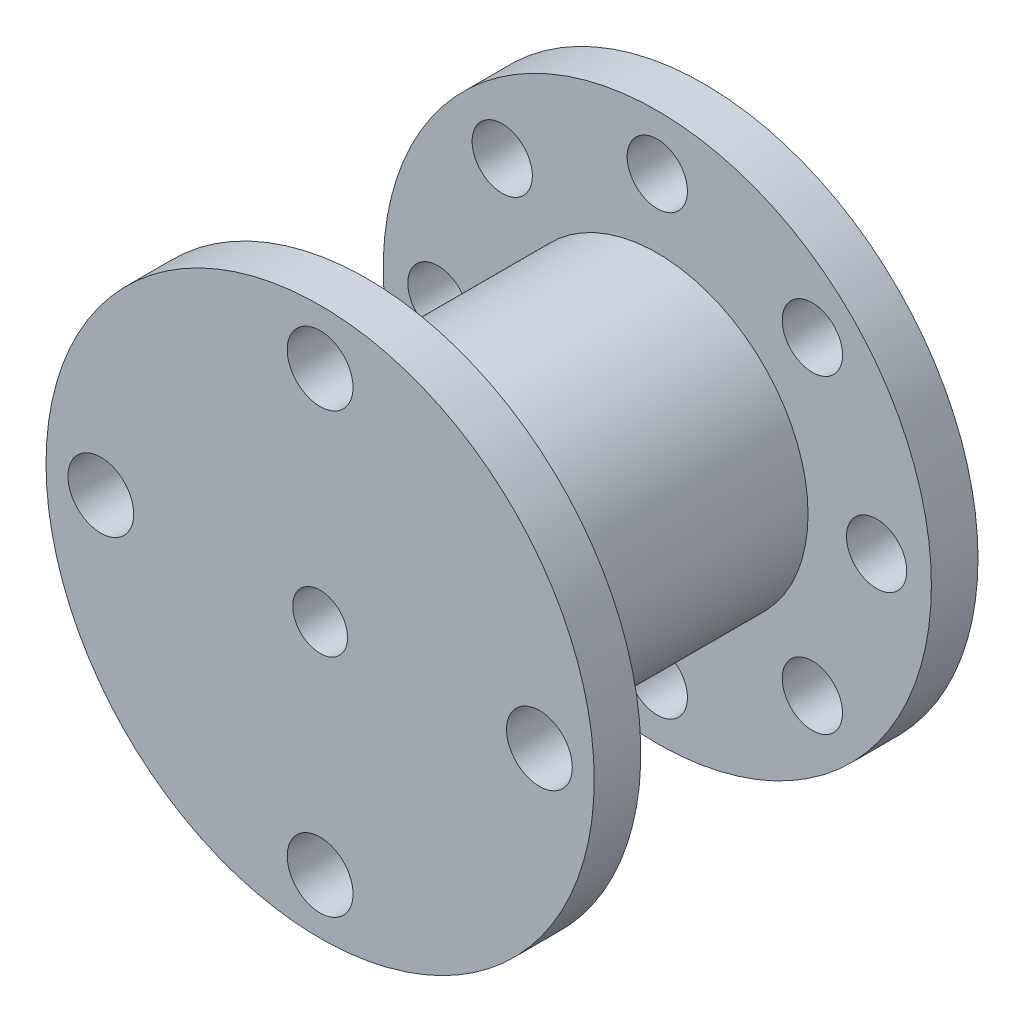
ISO-10303-21;
HEADER;
FILE_DESCRIPTION(('STEP AP214'),'2;1');
FILE_NAME('part.step','',(''),(''),'','','');
FILE_SCHEMA(('AUTOMOTIVE_DESIGN { 1 0 10303 214 1 1 1 1 }'));
ENDSEC;
DATA;
#1=APPLICATION_CONTEXT('core data for automotive mechanical design processes');
#2=APPLICATION_PROTOCOL_DEFINITION('international standard','automotive_design',2000,#1);
#3=PRODUCT_CONTEXT('',#1,'mechanical');
#4=PRODUCT('Part','Part','',(#3));
#5=PRODUCT_RELATED_PRODUCT_CATEGORY('part','',(#4));
#6=PRODUCT_DEFINITION_FORMATION('','',#4);
#7=PRODUCT_DEFINITION_CONTEXT('part definition',#1,'design');
#8=PRODUCT_DEFINITION('design','',#6,#7);
#9=PRODUCT_DEFINITION_SHAPE('','',#8);
#10=(LENGTH_UNIT() NAMED_UNIT(*) SI_UNIT(.MILLI.,.METRE.));
#11=(NAMED_UNIT(*) PLANE_ANGLE_UNIT() SI_UNIT($,.RADIAN.));
#12=(NAMED_UNIT(*) SI_UNIT($,.STERADIAN.) SOLID_ANGLE_UNIT());
#13=UNCERTAINTY_MEASURE_WITH_UNIT(LENGTH_MEASURE(1.E-05),#10,'distance_accuracy_value','');
#14=(GEOMETRIC_REPRESENTATION_CONTEXT(3) GLOBAL_UNCERTAINTY_ASSIGNED_CONTEXT((#13)) GLOBAL_UNIT_ASSIGNED_CONTEXT((#10,
#11,#12)) REPRESENTATION_CONTEXT('',''));
#15=CARTESIAN_POINT('',(0.,0.,0.));
#16=DIRECTION('',(0.,0.,1.));
#17=DIRECTION('',(1.,0.,0.));
#18=AXIS2_PLACEMENT_3D('',#15,#16,#17);
#19=CARTESIAN_POINT('',(22.1496616230781,17.8801690657236,14.));
#20=DIRECTION('',(0.,0.,-1.));
#21=DIRECTION('',(-1.,0.,0.));
#22=AXIS2_PLACEMENT_3D('',#19,#20,#21);
#23=CYLINDRICAL_SURFACE('',#22,9.99999999999999);
#24=CARTESIAN_POINT('',(22.1496616230781,17.8801690657236,14.));
#25=DIRECTION('',(0.,0.,1.));
#26=DIRECTION('',(1.,0.,0.));
#27=AXIS2_PLACEMENT_3D('',#24,#25,#26);
#28=CIRCLE('',#27,9.99999999999999);
#29=CARTESIAN_POINT('',(32.1496616230781,17.8801690657236,14.));
#30=VERTEX_POINT('',#29);
#31=EDGE_CURVE('E81',#30,#30,#28,.T.);
#32=ORIENTED_EDGE('',*,*,#31,.F.);
#33=EDGE_LOOP('',(#32));
#34=FACE_BOUND('',#33,.T.);
#35=CARTESIAN_POINT('',(22.1496616230781,17.8801690657236,12.3));
#36=DIRECTION('',(0.,0.,-1.));
#37=DIRECTION('',(-1.,0.,0.));
#38=AXIS2_PLACEMENT_3D('',#35,#36,#37);
#39=CIRCLE('',#38,9.99999999999999);
#40=CARTESIAN_POINT('',(12.1496616230781,17.8801690657236,12.3));
#41=VERTEX_POINT('',#40);
#42=EDGE_CURVE('E138',#41,#41,#39,.T.);
#43=ORIENTED_EDGE('',*,*,#42,.F.);
#44=EDGE_LOOP('',(#43));
#45=FACE_BOUND('',#44,.T.);
#46=ADVANCED_FACE('F43',(#34,#45),#23,.T.);
#47=CARTESIAN_POINT('',(14.1496616230781,17.8801690657236,11.));
#48=DIRECTION('',(0.,0.,1.));
#49=DIRECTION('',(1.,0.,0.));
#50=AXIS2_PLACEMENT_3D('',#47,#48,#49);
#51=CYLINDRICAL_SURFACE('',#50,1.2);
#52=CARTESIAN_POINT('',(14.1496616230781,17.8801690657236,14.));
#53=DIRECTION('',(0.,0.,1.));
#54=DIRECTION('',(1.,0.,0.));
#55=AXIS2_PLACEMENT_3D('',#52,#53,#54);
#56=CIRCLE('',#55,1.2);
#57=CARTESIAN_POINT('',(15.3496616230781,17.8801690657236,14.));
#58=VERTEX_POINT('',#57);
#59=EDGE_CURVE('E85',#58,#58,#56,.T.);
#60=ORIENTED_EDGE('',*,*,#59,.T.);
#61=EDGE_LOOP('',(#60));
#62=FACE_BOUND('',#61,.T.);
#63=CARTESIAN_POINT('',(14.1496616230781,17.8801690657236,12.3));
#64=DIRECTION('',(0.,0.,-1.));
#65=DIRECTION('',(-1.,0.,0.));
#66=AXIS2_PLACEMENT_3D('',#63,#64,#65);
#67=CIRCLE('',#66,1.2);
#68=CARTESIAN_POINT('',(12.9496616230781,17.8801690657236,12.3));
#69=VERTEX_POINT('',#68);
#70=EDGE_CURVE('E147',#69,#69,#67,.F.);
#71=ORIENTED_EDGE('',*,*,#70,.F.);
#72=EDGE_LOOP('',(#71));
#73=FACE_BOUND('',#72,.T.);
#74=ADVANCED_FACE('F176',(#62,#73),#51,.F.);
#75=CARTESIAN_POINT('',(22.1496616230781,25.8801690657236,11.));
#76=DIRECTION('',(0.,0.,1.));
#77=DIRECTION('',(1.,0.,0.));
#78=AXIS2_PLACEMENT_3D('',#75,#76,#77);
#79=CYLINDRICAL_SURFACE('',#78,1.2);
#80=CARTESIAN_POINT('',(22.1496616230781,25.8801690657236,14.));
#81=DIRECTION('',(0.,0.,1.));
#82=DIRECTION('',(1.,0.,0.));
#83=AXIS2_PLACEMENT_3D('',#80,#81,#82);
#84=CIRCLE('',#83,1.2);
#85=CARTESIAN_POINT('',(23.3496616230781,25.8801690657236,14.));
#86=VERTEX_POINT('',#85);
#87=EDGE_CURVE('E88',#86,#86,#84,.T.);
#88=ORIENTED_EDGE('',*,*,#87,.T.);
#89=EDGE_LOOP('',(#88));
#90=FACE_BOUND('',#89,.T.);
#91=CARTESIAN_POINT('',(22.1496616230781,25.8801690657236,12.3));
#92=DIRECTION('',(0.,0.,-1.));
#93=DIRECTION('',(-1.,0.,0.));
#94=AXIS2_PLACEMENT_3D('',#91,#92,#93);
#95=CIRCLE('',#94,1.2);
#96=CARTESIAN_POINT('',(20.9496616230781,25.8801690657236,12.3));
#97=VERTEX_POINT('',#96);
#98=EDGE_CURVE('E141',#97,#97,#95,.F.);
#99=ORIENTED_EDGE('',*,*,#98,.F.);
#100=EDGE_LOOP('',(#99));
#101=FACE_BOUND('',#100,.T.);
#102=ADVANCED_FACE('F181',(#90,#101),#79,.F.);
#103=CARTESIAN_POINT('',(22.1496616230781,9.88016906572357,11.));
#104=DIRECTION('',(0.,0.,1.));
#105=DIRECTION('',(1.,0.,0.));
#106=AXIS2_PLACEMENT_3D('',#103,#104,#105);
#107=CYLINDRICAL_SURFACE('',#106,1.2);
#108=CARTESIAN_POINT('',(22.1496616230781,9.88016906572357,14.));
#109=DIRECTION('',(0.,0.,1.));
#110=DIRECTION('',(1.,0.,0.));
#111=AXIS2_PLACEMENT_3D('',#108,#109,#110);
#112=CIRCLE('',#111,1.2);
#113=CARTESIAN_POINT('',(23.3496616230781,9.88016906572357,14.));
#114=VERTEX_POINT('',#113);
#115=EDGE_CURVE('E92',#114,#114,#112,.T.);
#116=ORIENTED_EDGE('',*,*,#115,.T.);
#117=EDGE_LOOP('',(#116));
#118=FACE_BOUND('',#117,.T.);
#119=CARTESIAN_POINT('',(22.1496616230781,9.88016906572357,12.3));
#120=DIRECTION('',(0.,0.,-1.));
#121=DIRECTION('',(-1.,0.,0.));
#122=AXIS2_PLACEMENT_3D('',#119,#120,#121);
#123=CIRCLE('',#122,1.2);
#124=CARTESIAN_POINT('',(20.9496616230781,9.88016906572357,12.3));
#125=VERTEX_POINT('',#124);
#126=EDGE_CURVE('E144',#125,#125,#123,.F.);
#127=ORIENTED_EDGE('',*,*,#126,.F.);
#128=EDGE_LOOP('',(#127));
#129=FACE_BOUND('',#128,.T.);
#130=ADVANCED_FACE('F189',(#118,#129),#107,.F.);
#131=CARTESIAN_POINT('',(30.1496616230781,17.8801690657236,11.));
#132=DIRECTION('',(0.,0.,1.));
#133=DIRECTION('',(1.,0.,0.));
#134=AXIS2_PLACEMENT_3D('',#131,#132,#133);
#135=CYLINDRICAL_SURFACE('',#134,1.2);
#136=CARTESIAN_POINT('',(30.1496616230781,17.8801690657236,14.));
#137=DIRECTION('',(0.,0.,1.));
#138=DIRECTION('',(1.,0.,0.));
#139=AXIS2_PLACEMENT_3D('',#136,#137,#138);
#140=CIRCLE('',#139,1.2);
#141=CARTESIAN_POINT('',(31.3496616230781,17.8801690657236,14.));
#142=VERTEX_POINT('',#141);
#143=EDGE_CURVE('E84',#142,#142,#140,.T.);
#144=ORIENTED_EDGE('',*,*,#143,.T.);
#145=EDGE_LOOP('',(#144));
#146=FACE_BOUND('',#145,.T.);
#147=CARTESIAN_POINT('',(30.1496616230781,17.8801690657236,12.3));
#148=DIRECTION('',(0.,0.,-1.));
#149=DIRECTION('',(-1.,0.,0.));
#150=AXIS2_PLACEMENT_3D('',#147,#148,#149);
#151=CIRCLE('',#150,1.2);
#152=CARTESIAN_POINT('',(28.9496616230781,17.8801690657236,12.3));
#153=VERTEX_POINT('',#152);
#154=EDGE_CURVE('E135',#153,#153,#151,.F.);
#155=ORIENTED_EDGE('',*,*,#154,.F.);
#156=EDGE_LOOP('',(#155));
#157=FACE_BOUND('',#156,.T.);
#158=ADVANCED_FACE('F193',(#146,#157),#135,.F.);
#159=CARTESIAN_POINT('',(22.1496616230781,17.8801690657236,0.));
#160=DIRECTION('',(0.,0.,1.));
#161=DIRECTION('',(1.,0.,0.));
#162=AXIS2_PLACEMENT_3D('',#159,#160,#161);
#163=CYLINDRICAL_SURFACE('',#162,1.);
#164=CARTESIAN_POINT('',(22.1496616230781,17.8801690657236,14.));
#165=DIRECTION('',(0.,0.,1.));
#166=DIRECTION('',(1.,0.,0.));
#167=AXIS2_PLACEMENT_3D('',#164,#165,#166);
#168=CIRCLE('',#167,1.);
#169=CARTESIAN_POINT('',(23.1496616230781,17.8801690657236,14.));
#170=VERTEX_POINT('',#169);
#171=EDGE_CURVE('E89',#170,#170,#168,.T.);
#172=ORIENTED_EDGE('',*,*,#171,.T.);
#173=EDGE_LOOP('',(#172));
#174=FACE_BOUND('',#173,.T.);
#175=CARTESIAN_POINT('',(22.1496616230781,17.8801690657236,3.));
#176=DIRECTION('',(0.,0.,-1.));
#177=DIRECTION('',(-1.,0.,0.));
#178=AXIS2_PLACEMENT_3D('',#175,#176,#177);
#179=CIRCLE('',#178,1.);
#180=CARTESIAN_POINT('',(21.1496616230781,17.8801690657236,3.));
#181=VERTEX_POINT('',#180);
#182=EDGE_CURVE('E132',#181,#181,#179,.F.);
#183=ORIENTED_EDGE('',*,*,#182,.F.);
#184=EDGE_LOOP('',(#183));
#185=FACE_BOUND('',#184,.T.);
#186=ADVANCED_FACE('F197',(#174,#185),#163,.F.);
#187=CARTESIAN_POINT('',(22.1496616230781,25.8801690657236,3.));
#188=DIRECTION('',(0.,0.,-1.));
#189=DIRECTION('',(-1.,0.,0.));
#190=AXIS2_PLACEMENT_3D('',#187,#188,#189);
#191=CYLINDRICAL_SURFACE('',#190,1.1);
#192=CARTESIAN_POINT('',(22.1496616230781,25.8801690657236,0.));
#193=DIRECTION('',(0.,0.,1.));
#194=DIRECTION('',(1.,0.,0.));
#195=AXIS2_PLACEMENT_3D('',#192,#193,#194);
#196=CIRCLE('',#195,1.1);
#197=CARTESIAN_POINT('',(23.2496616230781,25.8801690657236,0.));
#198=VERTEX_POINT('',#197);
#199=EDGE_CURVE('E50',#198,#198,#196,.T.);
#200=ORIENTED_EDGE('',*,*,#199,.F.);
#201=EDGE_LOOP('',(#200));
#202=FACE_BOUND('',#201,.T.);
#203=CARTESIAN_POINT('',(22.1496616230781,25.8801690657236,1.7));
#204=DIRECTION('',(0.,0.,1.));
#205=DIRECTION('',(1.,0.,0.));
#206=AXIS2_PLACEMENT_3D('',#203,#204,#205);
#207=CIRCLE('',#206,1.1);
#208=CARTESIAN_POINT('',(23.2496616230781,25.8801690657236,1.7));
#209=VERTEX_POINT('',#208);
#210=EDGE_CURVE('E126',#209,#209,#207,.F.);
#211=ORIENTED_EDGE('',*,*,#210,.F.);
#212=EDGE_LOOP('',(#211));
#213=FACE_BOUND('',#212,.T.);
#214=ADVANCED_FACE('F201',(#202,#213),#191,.F.);
#215=CARTESIAN_POINT('',(27.8065158725705,23.537023315216,3.));
#216=DIRECTION('',(0.,0.,-1.));
#217=DIRECTION('',(-1.,0.,0.));
#218=AXIS2_PLACEMENT_3D('',#215,#216,#217);
#219=CYLINDRICAL_SURFACE('',#218,1.1);
#220=CARTESIAN_POINT('',(27.8065158725705,23.537023315216,0.));
#221=DIRECTION('',(0.,0.,1.));
#222=DIRECTION('',(1.,0.,0.));
#223=AXIS2_PLACEMENT_3D('',#220,#221,#222);
#224=CIRCLE('',#223,1.1);
#225=CARTESIAN_POINT('',(28.9065158725705,23.537023315216,0.));
#226=VERTEX_POINT('',#225);
#227=EDGE_CURVE('E54',#226,#226,#224,.T.);
#228=ORIENTED_EDGE('',*,*,#227,.F.);
#229=EDGE_LOOP('',(#228));
#230=FACE_BOUND('',#229,.T.);
#231=CARTESIAN_POINT('',(27.8065158725705,23.537023315216,1.7));
#232=DIRECTION('',(0.,0.,1.));
#233=DIRECTION('',(1.,0.,0.));
#234=AXIS2_PLACEMENT_3D('',#231,#232,#233);
#235=CIRCLE('',#234,1.1);
#236=CARTESIAN_POINT('',(28.9065158725705,23.537023315216,1.7));
#237=VERTEX_POINT('',#236);
#238=EDGE_CURVE('E99',#237,#237,#235,.F.);
#239=ORIENTED_EDGE('',*,*,#238,.F.);
#240=EDGE_LOOP('',(#239));
#241=FACE_BOUND('',#240,.T.);
#242=ADVANCED_FACE('F243',(#230,#241),#219,.F.);
#243=CARTESIAN_POINT('',(27.8065158725705,12.2233148162312,3.));
#244=DIRECTION('',(0.,0.,-1.));
#245=DIRECTION('',(-1.,0.,0.));
#246=AXIS2_PLACEMENT_3D('',#243,#244,#245);
#247=CYLINDRICAL_SURFACE('',#246,1.1);
#248=CARTESIAN_POINT('',(27.8065158725705,12.2233148162312,0.));
#249=DIRECTION('',(0.,0.,1.));
#250=DIRECTION('',(1.,0.,0.));
#251=AXIS2_PLACEMENT_3D('',#248,#249,#250);
#252=CIRCLE('',#251,1.1);
#253=CARTESIAN_POINT('',(28.9065158725705,12.2233148162312,0.));
#254=VERTEX_POINT('',#253);
#255=EDGE_CURVE('E58',#254,#254,#252,.T.);
#256=ORIENTED_EDGE('',*,*,#255,.F.);
#257=EDGE_LOOP('',(#256));
#258=FACE_BOUND('',#257,.T.);
#259=CARTESIAN_POINT('',(27.8065158725705,12.2233148162312,1.7));
#260=DIRECTION('',(0.,0.,1.));
#261=DIRECTION('',(1.,0.,0.));
#262=AXIS2_PLACEMENT_3D('',#259,#260,#261);
#263=CIRCLE('',#262,1.1);
#264=CARTESIAN_POINT('',(28.9065158725705,12.2233148162312,1.7));
#265=VERTEX_POINT('',#264);
#266=EDGE_CURVE('E105',#265,#265,#263,.F.);
#267=ORIENTED_EDGE('',*,*,#266,.F.);
#268=EDGE_LOOP('',(#267));
#269=FACE_BOUND('',#268,.T.);
#270=ADVANCED_FACE('F254',(#258,#269),#247,.F.);
#271=CARTESIAN_POINT('',(16.4928073735857,23.537023315216,3.));
#272=DIRECTION('',(0.,0.,-1.));
#273=DIRECTION('',(-1.,0.,0.));
#274=AXIS2_PLACEMENT_3D('',#271,#272,#273);
#275=CYLINDRICAL_SURFACE('',#274,1.1);
#276=CARTESIAN_POINT('',(16.4928073735857,23.537023315216,0.));
#277=DIRECTION('',(0.,0.,1.));
#278=DIRECTION('',(1.,0.,0.));
#279=AXIS2_PLACEMENT_3D('',#276,#277,#278);
#280=CIRCLE('',#279,1.1);
#281=CARTESIAN_POINT('',(17.5928073735857,23.537023315216,0.));
#282=VERTEX_POINT('',#281);
#283=EDGE_CURVE('E63',#282,#282,#280,.T.);
#284=ORIENTED_EDGE('',*,*,#283,.F.);
#285=EDGE_LOOP('',(#284));
#286=FACE_BOUND('',#285,.T.);
#287=CARTESIAN_POINT('',(16.4928073735857,23.537023315216,1.7));
#288=DIRECTION('',(0.,0.,1.));
#289=DIRECTION('',(1.,0.,0.));
#290=AXIS2_PLACEMENT_3D('',#287,#288,#289);
#291=CIRCLE('',#290,1.1);
#292=CARTESIAN_POINT('',(17.5928073735857,23.537023315216,1.7));
#293=VERTEX_POINT('',#292);
#294=EDGE_CURVE('E114',#293,#293,#291,.F.);
#295=ORIENTED_EDGE('',*,*,#294,.F.);
#296=EDGE_LOOP('',(#295));
#297=FACE_BOUND('',#296,.T.);
#298=ADVANCED_FACE('F264',(#286,#297),#275,.F.);
#299=CARTESIAN_POINT('',(14.1496616230781,17.8801690657236,3.));
#300=DIRECTION('',(0.,0.,-1.));
#301=DIRECTION('',(-1.,0.,0.));
#302=AXIS2_PLACEMENT_3D('',#299,#300,#301);
#303=CYLINDRICAL_SURFACE('',#302,1.1);
#304=CARTESIAN_POINT('',(14.1496616230781,17.8801690657236,0.));
#305=DIRECTION('',(0.,0.,1.));
#306=DIRECTION('',(1.,0.,0.));
#307=AXIS2_PLACEMENT_3D('',#304,#305,#306);
#308=CIRCLE('',#307,1.1);
#309=CARTESIAN_POINT('',(15.2496616230781,17.8801690657236,0.));
#310=VERTEX_POINT('',#309);
#311=EDGE_CURVE('E66',#310,#310,#308,.T.);
#312=ORIENTED_EDGE('',*,*,#311,.F.);
#313=EDGE_LOOP('',(#312));
#314=FACE_BOUND('',#313,.T.);
#315=CARTESIAN_POINT('',(14.1496616230781,17.8801690657236,1.7));
#316=DIRECTION('',(0.,0.,1.));
#317=DIRECTION('',(1.,0.,0.));
#318=AXIS2_PLACEMENT_3D('',#315,#316,#317);
#319=CIRCLE('',#318,1.1);
#320=CARTESIAN_POINT('',(15.2496616230781,17.8801690657236,1.7));
#321=VERTEX_POINT('',#320);
#322=EDGE_CURVE('E111',#321,#321,#319,.F.);
#323=ORIENTED_EDGE('',*,*,#322,.F.);
#324=EDGE_LOOP('',(#323));
#325=FACE_BOUND('',#324,.T.);
#326=ADVANCED_FACE('F274',(#314,#325),#303,.F.);
#327=CARTESIAN_POINT('',(22.1496616230781,9.88016906572357,3.));
#328=DIRECTION('',(0.,0.,-1.));
#329=DIRECTION('',(-1.,0.,0.));
#330=AXIS2_PLACEMENT_3D('',#327,#328,#329);
#331=CYLINDRICAL_SURFACE('',#330,1.1);
#332=CARTESIAN_POINT('',(22.1496616230781,9.88016906572357,0.));
#333=DIRECTION('',(0.,0.,1.));
#334=DIRECTION('',(1.,0.,0.));
#335=AXIS2_PLACEMENT_3D('',#332,#333,#334);
#336=CIRCLE('',#335,1.1);
#337=CARTESIAN_POINT('',(23.2496616230781,9.88016906572357,0.));
#338=VERTEX_POINT('',#337);
#339=EDGE_CURVE('E69',#338,#338,#336,.T.);
#340=ORIENTED_EDGE('',*,*,#339,.F.);
#341=EDGE_LOOP('',(#340));
#342=FACE_BOUND('',#341,.T.);
#343=CARTESIAN_POINT('',(22.1496616230781,9.88016906572357,1.7));
#344=DIRECTION('',(0.,0.,1.));
#345=DIRECTION('',(1.,0.,0.));
#346=AXIS2_PLACEMENT_3D('',#343,#344,#345);
#347=CIRCLE('',#346,1.1);
#348=CARTESIAN_POINT('',(23.2496616230781,9.88016906572357,1.7));
#349=VERTEX_POINT('',#348);
#350=EDGE_CURVE('E120',#349,#349,#347,.F.);
#351=ORIENTED_EDGE('',*,*,#350,.F.);
#352=EDGE_LOOP('',(#351));
#353=FACE_BOUND('',#352,.T.);
#354=ADVANCED_FACE('F284',(#342,#353),#331,.F.);
#355=CARTESIAN_POINT('',(16.4928073735857,12.2233148162312,3.));
#356=DIRECTION('',(0.,0.,-1.));
#357=DIRECTION('',(-1.,0.,0.));
#358=AXIS2_PLACEMENT_3D('',#355,#356,#357);
#359=CYLINDRICAL_SURFACE('',#358,1.1);
#360=CARTESIAN_POINT('',(16.4928073735857,12.2233148162312,0.));
#361=DIRECTION('',(0.,0.,1.));
#362=DIRECTION('',(1.,0.,0.));
#363=AXIS2_PLACEMENT_3D('',#360,#361,#362);
#364=CIRCLE('',#363,1.1);
#365=CARTESIAN_POINT('',(17.5928073735857,12.2233148162312,0.));
#366=VERTEX_POINT('',#365);
#367=EDGE_CURVE('E72',#366,#366,#364,.T.);
#368=ORIENTED_EDGE('',*,*,#367,.F.);
#369=EDGE_LOOP('',(#368));
#370=FACE_BOUND('',#369,.T.);
#371=CARTESIAN_POINT('',(16.4928073735857,12.2233148162312,1.7));
#372=DIRECTION('',(0.,0.,1.));
#373=DIRECTION('',(1.,0.,0.));
#374=AXIS2_PLACEMENT_3D('',#371,#372,#373);
#375=CIRCLE('',#374,1.1);
#376=CARTESIAN_POINT('',(17.5928073735857,12.2233148162312,1.7));
#377=VERTEX_POINT('',#376);
#378=EDGE_CURVE('E108',#377,#377,#375,.F.);
#379=ORIENTED_EDGE('',*,*,#378,.F.);
#380=EDGE_LOOP('',(#379));
#381=FACE_BOUND('',#380,.T.);
#382=ADVANCED_FACE('F294',(#370,#381),#359,.F.);
#383=CARTESIAN_POINT('',(22.1496616230781,17.8801690657236,3.));
#384=DIRECTION('',(0.,0.,-1.));
#385=DIRECTION('',(-1.,0.,0.));
#386=AXIS2_PLACEMENT_3D('',#383,#384,#385);
#387=CYLINDRICAL_SURFACE('',#386,10.);
#388=CARTESIAN_POINT('',(22.1496616230781,17.8801690657236,0.));
#389=DIRECTION('',(0.,0.,1.));
#390=DIRECTION('',(1.,0.,0.));
#391=AXIS2_PLACEMENT_3D('',#388,#389,#390);
#392=CIRCLE('',#391,10.);
#393=CARTESIAN_POINT('',(32.1496616230781,17.8801690657236,0.));
#394=VERTEX_POINT('',#393);
#395=EDGE_CURVE('E75',#394,#394,#392,.T.);
#396=ORIENTED_EDGE('',*,*,#395,.T.);
#397=EDGE_LOOP('',(#396));
#398=FACE_BOUND('',#397,.T.);
#399=CARTESIAN_POINT('',(22.1496616230781,17.8801690657236,1.7));
#400=DIRECTION('',(0.,0.,1.));
#401=DIRECTION('',(1.,0.,0.));
#402=AXIS2_PLACEMENT_3D('',#399,#400,#401);
#403=CIRCLE('',#402,10.);
#404=CARTESIAN_POINT('',(32.1496616230781,17.8801690657236,1.7));
#405=VERTEX_POINT('',#404);
#406=EDGE_CURVE('E123',#405,#405,#403,.T.);
#407=ORIENTED_EDGE('',*,*,#406,.F.);
#408=EDGE_LOOP('',(#407));
#409=FACE_BOUND('',#408,.T.);
#410=ADVANCED_FACE('F45',(#398,#409),#387,.T.);
#411=CARTESIAN_POINT('',(30.1496616230781,17.8801690657236,3.));
#412=DIRECTION('',(0.,0.,-1.));
#413=DIRECTION('',(-1.,0.,0.));
#414=AXIS2_PLACEMENT_3D('',#411,#412,#413);
#415=CYLINDRICAL_SURFACE('',#414,1.1);
#416=CARTESIAN_POINT('',(30.1496616230781,17.8801690657236,0.));
#417=DIRECTION('',(0.,0.,1.));
#418=DIRECTION('',(1.,0.,0.));
#419=AXIS2_PLACEMENT_3D('',#416,#417,#418);
#420=CIRCLE('',#419,1.1);
#421=CARTESIAN_POINT('',(31.2496616230781,17.8801690657236,0.));
#422=VERTEX_POINT('',#421);
#423=EDGE_CURVE('E11',#422,#422,#420,.T.);
#424=ORIENTED_EDGE('',*,*,#423,.F.);
#425=EDGE_LOOP('',(#424));
#426=FACE_BOUND('',#425,.T.);
#427=CARTESIAN_POINT('',(30.1496616230781,17.8801690657236,1.7));
#428=DIRECTION('',(0.,0.,1.));
#429=DIRECTION('',(1.,0.,0.));
#430=AXIS2_PLACEMENT_3D('',#427,#428,#429);
#431=CIRCLE('',#430,1.1);
#432=CARTESIAN_POINT('',(31.2496616230781,17.8801690657236,1.7));
#433=VERTEX_POINT('',#432);
#434=EDGE_CURVE('E102',#433,#433,#431,.F.);
#435=ORIENTED_EDGE('',*,*,#434,.F.);
#436=EDGE_LOOP('',(#435));
#437=FACE_BOUND('',#436,.T.);
#438=ADVANCED_FACE('F311',(#426,#437),#415,.F.);
#439=CARTESIAN_POINT('',(0.,0.,0.));
#440=DIRECTION('',(0.,0.,1.));
#441=DIRECTION('',(1.,0.,0.));
#442=AXIS2_PLACEMENT_3D('',#439,#440,#441);
#443=PLANE('',#442);
#444=CARTESIAN_POINT('',(22.1496616230781,17.8801690657236,0.));
#445=DIRECTION('',(0.,0.,-1.));
#446=DIRECTION('',(-1.,0.,0.));
#447=AXIS2_PLACEMENT_3D('',#444,#445,#446);
#448=CIRCLE('',#447,4.5);
#449=CARTESIAN_POINT('',(17.6496616230781,17.8801690657236,0.));
#450=VERTEX_POINT('',#449);
#451=EDGE_CURVE('E78',#450,#450,#448,.T.);
#452=ORIENTED_EDGE('',*,*,#451,.F.);
#453=EDGE_LOOP('',(#452));
#454=FACE_BOUND('',#453,.T.);
#455=ORIENTED_EDGE('',*,*,#395,.F.);
#456=EDGE_LOOP('',(#455));
#457=FACE_BOUND('',#456,.T.);
#458=ORIENTED_EDGE('',*,*,#367,.T.);
#459=EDGE_LOOP('',(#458));
#460=FACE_BOUND('',#459,.T.);
#461=ORIENTED_EDGE('',*,*,#339,.T.);
#462=EDGE_LOOP('',(#461));
#463=FACE_BOUND('',#462,.T.);
#464=ORIENTED_EDGE('',*,*,#311,.T.);
#465=EDGE_LOOP('',(#464));
#466=FACE_BOUND('',#465,.T.);
#467=ORIENTED_EDGE('',*,*,#283,.T.);
#468=EDGE_LOOP('',(#467));
#469=FACE_BOUND('',#468,.T.);
#470=ORIENTED_EDGE('',*,*,#255,.T.);
#471=EDGE_LOOP('',(#470));
#472=FACE_BOUND('',#471,.T.);
#473=ORIENTED_EDGE('',*,*,#227,.T.);
#474=EDGE_LOOP('',(#473));
#475=FACE_BOUND('',#474,.T.);
#476=ORIENTED_EDGE('',*,*,#199,.T.);
#477=EDGE_LOOP('',(#476));
#478=FACE_BOUND('',#477,.T.);
#479=ORIENTED_EDGE('',*,*,#423,.T.);
#480=EDGE_LOOP('',(#479));
#481=FACE_BOUND('',#480,.T.);
#482=ADVANCED_FACE('F170',(#454,#457,#460,#463,#466,#469,#472,#475,#478,#481),#443,.F.);
#483=CARTESIAN_POINT('',(22.1496616230781,17.8801690657236,2.));
#484=DIRECTION('',(0.,0.,-1.));
#485=DIRECTION('',(-1.,0.,0.));
#486=AXIS2_PLACEMENT_3D('',#483,#484,#485);
#487=CYLINDRICAL_SURFACE('',#486,4.5);
#488=ORIENTED_EDGE('',*,*,#451,.T.);
#489=EDGE_LOOP('',(#488));
#490=FACE_BOUND('',#489,.T.);
#491=CARTESIAN_POINT('',(22.1496616230781,17.8801690657236,3.));
#492=DIRECTION('',(0.,0.,-1.));
#493=DIRECTION('',(-1.,0.,0.));
#494=AXIS2_PLACEMENT_3D('',#491,#492,#493);
#495=CIRCLE('',#494,4.5);
#496=CARTESIAN_POINT('',(17.6496616230781,17.8801690657236,3.));
#497=VERTEX_POINT('',#496);
#498=EDGE_CURVE('E129',#497,#497,#495,.T.);
#499=ORIENTED_EDGE('',*,*,#498,.F.);
#500=EDGE_LOOP('',(#499));
#501=FACE_BOUND('',#500,.T.);
#502=ADVANCED_FACE('F160',(#490,#501),#487,.F.);
#503=CARTESIAN_POINT('',(22.1496616230781,17.8801690657236,11.));
#504=DIRECTION('',(0.,0.,-1.));
#505=DIRECTION('',(-1.,0.,0.));
#506=AXIS2_PLACEMENT_3D('',#503,#504,#505);
#507=CYLINDRICAL_SURFACE('',#506,5.5);
#508=CARTESIAN_POINT('',(22.1496616230781,17.8801690657236,1.7));
#509=DIRECTION('',(0.,0.,1.));
#510=DIRECTION('',(1.,0.,0.));
#511=AXIS2_PLACEMENT_3D('',#508,#509,#510);
#512=CIRCLE('',#511,5.5);
#513=CARTESIAN_POINT('',(27.6496616230781,17.8801690657236,1.7));
#514=VERTEX_POINT('',#513);
#515=EDGE_CURVE('E117',#514,#514,#512,.F.);
#516=ORIENTED_EDGE('',*,*,#515,.F.);
#517=EDGE_LOOP('',(#516));
#518=FACE_BOUND('',#517,.T.);
#519=CARTESIAN_POINT('',(22.1496616230781,17.8801690657236,12.3));
#520=DIRECTION('',(0.,0.,-1.));
#521=DIRECTION('',(-1.,0.,0.));
#522=AXIS2_PLACEMENT_3D('',#519,#520,#521);
#523=CIRCLE('',#522,5.5);
#524=CARTESIAN_POINT('',(16.6496616230781,17.8801690657236,12.3));
#525=VERTEX_POINT('',#524);
#526=EDGE_CURVE('E150',#525,#525,#523,.F.);
#527=ORIENTED_EDGE('',*,*,#526,.F.);
#528=EDGE_LOOP('',(#527));
#529=FACE_BOUND('',#528,.T.);
#530=ADVANCED_FACE('F157',(#518,#529),#507,.T.);
#531=CARTESIAN_POINT('',(0.,0.,14.));
#532=DIRECTION('',(0.,0.,1.));
#533=DIRECTION('',(1.,0.,0.));
#534=AXIS2_PLACEMENT_3D('',#531,#532,#533);
#535=PLANE('',#534);
#536=ORIENTED_EDGE('',*,*,#171,.F.);
#537=EDGE_LOOP('',(#536));
#538=FACE_BOUND('',#537,.T.);
#539=ORIENTED_EDGE('',*,*,#143,.F.);
#540=EDGE_LOOP('',(#539));
#541=FACE_BOUND('',#540,.T.);
#542=ORIENTED_EDGE('',*,*,#115,.F.);
#543=EDGE_LOOP('',(#542));
#544=FACE_BOUND('',#543,.T.);
#545=ORIENTED_EDGE('',*,*,#87,.F.);
#546=EDGE_LOOP('',(#545));
#547=FACE_BOUND('',#546,.T.);
#548=ORIENTED_EDGE('',*,*,#59,.F.);
#549=EDGE_LOOP('',(#548));
#550=FACE_BOUND('',#549,.T.);
#551=ORIENTED_EDGE('',*,*,#31,.T.);
#552=EDGE_LOOP('',(#551));
#553=FACE_BOUND('',#552,.T.);
#554=ADVANCED_FACE('F159',(#538,#541,#544,#547,#550,#553),#535,.T.);
#555=CARTESIAN_POINT('',(0.,0.,1.7));
#556=DIRECTION('',(0.,0.,1.));
#557=DIRECTION('',(1.,0.,0.));
#558=AXIS2_PLACEMENT_3D('',#555,#556,#557);
#559=PLANE('',#558);
#560=ORIENTED_EDGE('',*,*,#210,.T.);
#561=EDGE_LOOP('',(#560));
#562=FACE_BOUND('',#561,.T.);
#563=ORIENTED_EDGE('',*,*,#406,.T.);
#564=EDGE_LOOP('',(#563));
#565=FACE_BOUND('',#564,.T.);
#566=ORIENTED_EDGE('',*,*,#350,.T.);
#567=EDGE_LOOP('',(#566));
#568=FACE_BOUND('',#567,.T.);
#569=ORIENTED_EDGE('',*,*,#515,.T.);
#570=EDGE_LOOP('',(#569));
#571=FACE_BOUND('',#570,.T.);
#572=ORIENTED_EDGE('',*,*,#294,.T.);
#573=EDGE_LOOP('',(#572));
#574=FACE_BOUND('',#573,.T.);
#575=ORIENTED_EDGE('',*,*,#322,.T.);
#576=EDGE_LOOP('',(#575));
#577=FACE_BOUND('',#576,.T.);
#578=ORIENTED_EDGE('',*,*,#378,.T.);
#579=EDGE_LOOP('',(#578));
#580=FACE_BOUND('',#579,.T.);
#581=ORIENTED_EDGE('',*,*,#266,.T.);
#582=EDGE_LOOP('',(#581));
#583=FACE_BOUND('',#582,.T.);
#584=ORIENTED_EDGE('',*,*,#434,.T.);
#585=EDGE_LOOP('',(#584));
#586=FACE_BOUND('',#585,.T.);
#587=ORIENTED_EDGE('',*,*,#238,.T.);
#588=EDGE_LOOP('',(#587));
#589=FACE_BOUND('',#588,.T.);
#590=ADVANCED_FACE('F167',(#562,#565,#568,#571,#574,#577,#580,#583,#586,#589),#559,.T.);
#591=CARTESIAN_POINT('',(0.,0.,3.));
#592=DIRECTION('',(0.,0.,-1.));
#593=DIRECTION('',(-1.,0.,0.));
#594=AXIS2_PLACEMENT_3D('',#591,#592,#593);
#595=PLANE('',#594);
#596=ORIENTED_EDGE('',*,*,#182,.T.);
#597=EDGE_LOOP('',(#596));
#598=FACE_BOUND('',#597,.T.);
#599=ORIENTED_EDGE('',*,*,#498,.T.);
#600=EDGE_LOOP('',(#599));
#601=FACE_BOUND('',#600,.T.);
#602=ADVANCED_FACE('F205',(#598,#601),#595,.T.);
#603=CARTESIAN_POINT('',(0.,0.,12.3));
#604=DIRECTION('',(0.,0.,-1.));
#605=DIRECTION('',(-1.,0.,0.));
#606=AXIS2_PLACEMENT_3D('',#603,#604,#605);
#607=PLANE('',#606);
#608=ORIENTED_EDGE('',*,*,#526,.T.);
#609=EDGE_LOOP('',(#608));
#610=FACE_BOUND('',#609,.T.);
#611=ORIENTED_EDGE('',*,*,#70,.T.);
#612=EDGE_LOOP('',(#611));
#613=FACE_BOUND('',#612,.T.);
#614=ORIENTED_EDGE('',*,*,#126,.T.);
#615=EDGE_LOOP('',(#614));
#616=FACE_BOUND('',#615,.T.);
#617=ORIENTED_EDGE('',*,*,#98,.T.);
#618=EDGE_LOOP('',(#617));
#619=FACE_BOUND('',#618,.T.);
#620=ORIENTED_EDGE('',*,*,#42,.T.);
#621=EDGE_LOOP('',(#620));
#622=FACE_BOUND('',#621,.T.);
#623=ORIENTED_EDGE('',*,*,#154,.T.);
#624=EDGE_LOOP('',(#623));
#625=FACE_BOUND('',#624,.T.);
#626=ADVANCED_FACE('F154',(#610,#613,#616,#619,#622,#625),#607,.T.);
#627=CLOSED_SHELL('',(#46,#74,#102,#130,#158,#186,#214,#242,#270,#298,#326,#354,#382,#410,#438,
#482,#502,#530,#554,#590,#602,#626));
#628=MANIFOLD_SOLID_BREP('B2',#627);
#629=ADVANCED_BREP_SHAPE_REPRESENTATION('',(#18,#628),#14);
#630=SHAPE_DEFINITION_REPRESENTATION(#9,#629);
ENDSEC;
END-ISO-10303-21;
